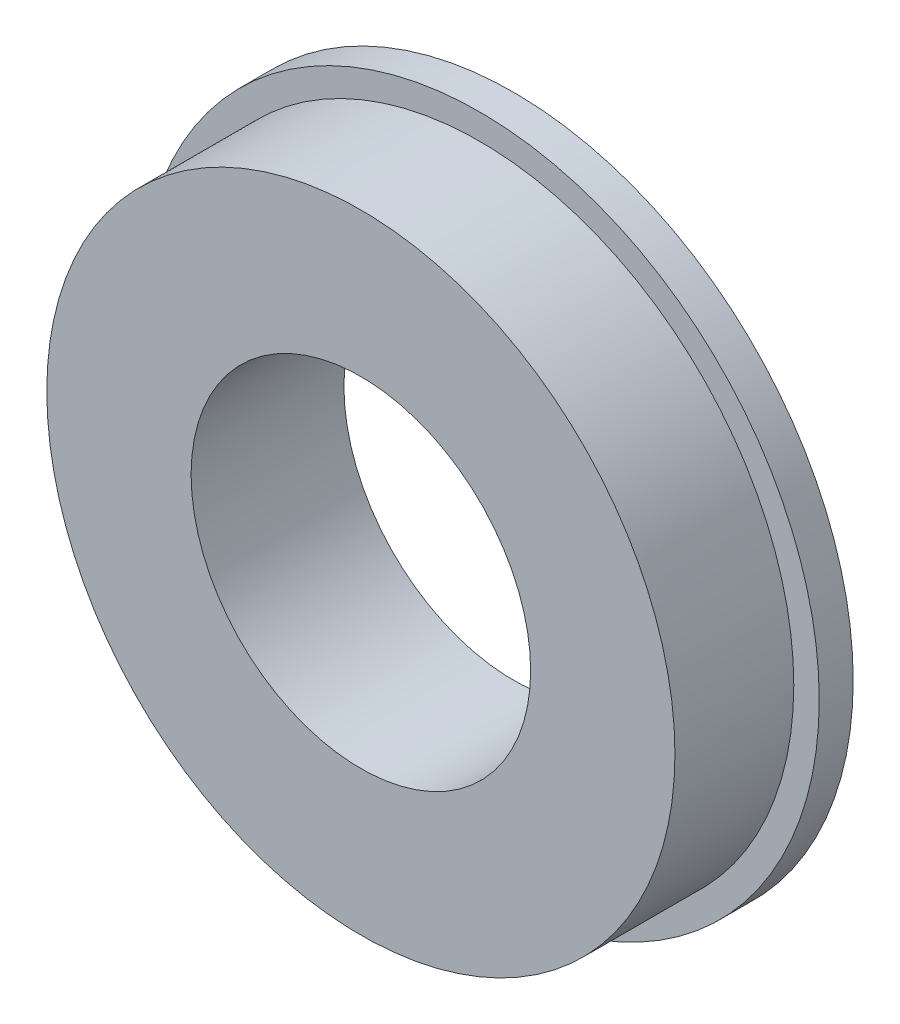
ISO-10303-21;
HEADER;
FILE_DESCRIPTION(('STEP AP214'),'2;1');
FILE_NAME('part.step','',(''),(''),'','','');
FILE_SCHEMA(('AUTOMOTIVE_DESIGN { 1 0 10303 214 1 1 1 1 }'));
ENDSEC;
DATA;
#1=APPLICATION_CONTEXT('core data for automotive mechanical design processes');
#2=APPLICATION_PROTOCOL_DEFINITION('international standard','automotive_design',2000,#1);
#3=PRODUCT_CONTEXT('',#1,'mechanical');
#4=PRODUCT('Part','Part','',(#3));
#5=PRODUCT_RELATED_PRODUCT_CATEGORY('part','',(#4));
#6=PRODUCT_DEFINITION_FORMATION('','',#4);
#7=PRODUCT_DEFINITION_CONTEXT('part definition',#1,'design');
#8=PRODUCT_DEFINITION('design','',#6,#7);
#9=PRODUCT_DEFINITION_SHAPE('','',#8);
#10=(LENGTH_UNIT() NAMED_UNIT(*) SI_UNIT(.MILLI.,.METRE.));
#11=(NAMED_UNIT(*) PLANE_ANGLE_UNIT() SI_UNIT($,.RADIAN.));
#12=(NAMED_UNIT(*) SI_UNIT($,.STERADIAN.) SOLID_ANGLE_UNIT());
#13=UNCERTAINTY_MEASURE_WITH_UNIT(LENGTH_MEASURE(1.E-05),#10,'distance_accuracy_value','');
#14=(GEOMETRIC_REPRESENTATION_CONTEXT(3) GLOBAL_UNCERTAINTY_ASSIGNED_CONTEXT((#13)) GLOBAL_UNIT_ASSIGNED_CONTEXT((#10,
#11,#12)) REPRESENTATION_CONTEXT('',''));
#15=CARTESIAN_POINT('',(0.,0.,0.));
#16=DIRECTION('',(0.,0.,1.));
#17=DIRECTION('',(1.,0.,0.));
#18=AXIS2_PLACEMENT_3D('',#15,#16,#17);
#19=CARTESIAN_POINT('',(0.,0.,0.));
#20=DIRECTION('',(0.,0.,1.));
#21=DIRECTION('',(1.,0.,0.));
#22=AXIS2_PLACEMENT_3D('',#19,#20,#21);
#23=PLANE('',#22);
#24=CARTESIAN_POINT('',(0.,0.,0.));
#25=DIRECTION('',(0.,0.,1.));
#26=DIRECTION('',(1.,0.,0.));
#27=AXIS2_PLACEMENT_3D('',#24,#25,#26);
#28=CIRCLE('',#27,10.);
#29=CARTESIAN_POINT('',(10.,0.,0.));
#30=VERTEX_POINT('',#29);
#31=EDGE_CURVE('E48',#30,#30,#28,.T.);
#32=ORIENTED_EDGE('',*,*,#31,.T.);
#33=EDGE_LOOP('',(#32));
#34=FACE_BOUND('',#33,.T.);
#35=CARTESIAN_POINT('',(0.,0.,0.));
#36=DIRECTION('',(0.,0.,-1.));
#37=DIRECTION('',(-1.,0.,0.));
#38=AXIS2_PLACEMENT_3D('',#35,#36,#37);
#39=CIRCLE('',#38,14.1663841240872);
#40=CARTESIAN_POINT('',(-14.1663841240872,0.,0.));
#41=VERTEX_POINT('',#40);
#42=EDGE_CURVE('E61',#41,#41,#39,.T.);
#43=ORIENTED_EDGE('',*,*,#42,.T.);
#44=EDGE_LOOP('',(#43));
#45=FACE_BOUND('',#44,.T.);
#46=ADVANCED_FACE('F31',(#34,#45),#23,.F.);
#47=CARTESIAN_POINT('',(0.,0.,2.));
#48=DIRECTION('',(0.,0.,-1.));
#49=DIRECTION('',(-1.,0.,0.));
#50=AXIS2_PLACEMENT_3D('',#47,#48,#49);
#51=CYLINDRICAL_SURFACE('',#50,20.);
#52=CARTESIAN_POINT('',(0.,0.,2.));
#53=DIRECTION('',(0.,0.,1.));
#54=DIRECTION('',(1.,0.,0.));
#55=AXIS2_PLACEMENT_3D('',#52,#53,#54);
#56=CIRCLE('',#55,20.);
#57=CARTESIAN_POINT('',(20.,0.,2.));
#58=VERTEX_POINT('',#57);
#59=EDGE_CURVE('E39',#58,#58,#56,.T.);
#60=ORIENTED_EDGE('',*,*,#59,.F.);
#61=EDGE_LOOP('',(#60));
#62=FACE_BOUND('',#61,.T.);
#63=CARTESIAN_POINT('',(0.,0.,0.));
#64=DIRECTION('',(0.,0.,1.));
#65=DIRECTION('',(1.,0.,0.));
#66=AXIS2_PLACEMENT_3D('',#63,#64,#65);
#67=CIRCLE('',#66,20.);
#68=CARTESIAN_POINT('',(20.,0.,0.));
#69=VERTEX_POINT('',#68);
#70=EDGE_CURVE('E35',#69,#69,#67,.T.);
#71=ORIENTED_EDGE('',*,*,#70,.T.);
#72=EDGE_LOOP('',(#71));
#73=FACE_BOUND('',#72,.T.);
#74=ADVANCED_FACE('F33',(#62,#73),#51,.T.);
#75=CARTESIAN_POINT('',(0.,0.,2.));
#76=DIRECTION('',(0.,0.,1.));
#77=DIRECTION('',(1.,0.,0.));
#78=AXIS2_PLACEMENT_3D('',#75,#76,#77);
#79=PLANE('',#78);
#80=CARTESIAN_POINT('',(0.,0.,2.));
#81=DIRECTION('',(0.,0.,1.));
#82=DIRECTION('',(1.,0.,0.));
#83=AXIS2_PLACEMENT_3D('',#80,#81,#82);
#84=CIRCLE('',#83,18.5);
#85=CARTESIAN_POINT('',(18.5,0.,2.));
#86=VERTEX_POINT('',#85);
#87=EDGE_CURVE('E10',#86,#86,#84,.T.);
#88=ORIENTED_EDGE('',*,*,#87,.F.);
#89=EDGE_LOOP('',(#88));
#90=FACE_BOUND('',#89,.T.);
#91=ORIENTED_EDGE('',*,*,#59,.T.);
#92=EDGE_LOOP('',(#91));
#93=FACE_BOUND('',#92,.T.);
#94=ADVANCED_FACE('F87',(#90,#93),#79,.T.);
#95=CARTESIAN_POINT('',(0.,0.,0.));
#96=DIRECTION('',(0.,0.,-1.));
#97=DIRECTION('',(-1.,0.,0.));
#98=AXIS2_PLACEMENT_3D('',#95,#96,#97);
#99=CIRCLE('',#98,16.6386159110818);
#100=CARTESIAN_POINT('',(-16.6386159110818,0.,0.));
#101=VERTEX_POINT('',#100);
#102=EDGE_CURVE('E55',#101,#101,#99,.T.);
#103=ORIENTED_EDGE('',*,*,#102,.F.);
#104=EDGE_LOOP('',(#103));
#105=FACE_BOUND('',#104,.T.);
#106=ORIENTED_EDGE('',*,*,#70,.F.);
#107=EDGE_LOOP('',(#106));
#108=FACE_BOUND('',#107,.T.);
#109=ADVANCED_FACE('F83',(#105,#108),#23,.F.);
#110=CARTESIAN_POINT('',(0.,0.,9.));
#111=DIRECTION('',(0.,0.,-1.));
#112=DIRECTION('',(-1.,0.,0.));
#113=AXIS2_PLACEMENT_3D('',#110,#111,#112);
#114=CYLINDRICAL_SURFACE('',#113,18.5);
#115=CARTESIAN_POINT('',(0.,0.,9.));
#116=DIRECTION('',(0.,0.,1.));
#117=DIRECTION('',(1.,0.,0.));
#118=AXIS2_PLACEMENT_3D('',#115,#116,#117);
#119=CIRCLE('',#118,18.5);
#120=CARTESIAN_POINT('',(18.5,0.,9.));
#121=VERTEX_POINT('',#120);
#122=EDGE_CURVE('E45',#121,#121,#119,.T.);
#123=ORIENTED_EDGE('',*,*,#122,.F.);
#124=EDGE_LOOP('',(#123));
#125=FACE_BOUND('',#124,.T.);
#126=ORIENTED_EDGE('',*,*,#87,.T.);
#127=EDGE_LOOP('',(#126));
#128=FACE_BOUND('',#127,.T.);
#129=ADVANCED_FACE('F86',(#125,#128),#114,.T.);
#130=CARTESIAN_POINT('',(0.,0.,9.));
#131=DIRECTION('',(0.,0.,1.));
#132=DIRECTION('',(1.,0.,0.));
#133=AXIS2_PLACEMENT_3D('',#130,#131,#132);
#134=PLANE('',#133);
#135=CARTESIAN_POINT('',(0.,0.,9.));
#136=DIRECTION('',(0.,0.,1.));
#137=DIRECTION('',(1.,0.,0.));
#138=AXIS2_PLACEMENT_3D('',#135,#136,#137);
#139=CIRCLE('',#138,10.);
#140=CARTESIAN_POINT('',(10.,0.,9.));
#141=VERTEX_POINT('',#140);
#142=EDGE_CURVE('E49',#141,#141,#139,.T.);
#143=ORIENTED_EDGE('',*,*,#142,.F.);
#144=EDGE_LOOP('',(#143));
#145=FACE_BOUND('',#144,.T.);
#146=ORIENTED_EDGE('',*,*,#122,.T.);
#147=EDGE_LOOP('',(#146));
#148=FACE_BOUND('',#147,.T.);
#149=ADVANCED_FACE('F108',(#145,#148),#134,.T.);
#150=CARTESIAN_POINT('',(0.,0.,0.));
#151=DIRECTION('',(0.,0.,1.));
#152=DIRECTION('',(1.,0.,0.));
#153=AXIS2_PLACEMENT_3D('',#150,#151,#152);
#154=CYLINDRICAL_SURFACE('',#153,10.);
#155=ORIENTED_EDGE('',*,*,#31,.F.);
#156=EDGE_LOOP('',(#155));
#157=FACE_BOUND('',#156,.T.);
#158=ORIENTED_EDGE('',*,*,#142,.T.);
#159=EDGE_LOOP('',(#158));
#160=FACE_BOUND('',#159,.T.);
#161=ADVANCED_FACE('F79',(#157,#160),#154,.F.);
#162=CARTESIAN_POINT('',(0.,0.,0.5));
#163=DIRECTION('',(0.,0.,-1.));
#164=DIRECTION('',(-1.,0.,0.));
#165=AXIS2_PLACEMENT_3D('',#162,#163,#164);
#166=CYLINDRICAL_SURFACE('',#165,16.6386159110818);
#167=CARTESIAN_POINT('',(0.,0.,0.5));
#168=DIRECTION('',(0.,0.,-1.));
#169=DIRECTION('',(-1.,0.,0.));
#170=AXIS2_PLACEMENT_3D('',#167,#168,#169);
#171=CIRCLE('',#170,16.6386159110818);
#172=CARTESIAN_POINT('',(-16.6386159110818,0.,0.5));
#173=VERTEX_POINT('',#172);
#174=EDGE_CURVE('E52',#173,#173,#171,.T.);
#175=ORIENTED_EDGE('',*,*,#174,.F.);
#176=EDGE_LOOP('',(#175));
#177=FACE_BOUND('',#176,.T.);
#178=ORIENTED_EDGE('',*,*,#102,.T.);
#179=EDGE_LOOP('',(#178));
#180=FACE_BOUND('',#179,.T.);
#181=ADVANCED_FACE('F73',(#177,#180),#166,.F.);
#182=CARTESIAN_POINT('',(0.,0.,0.5));
#183=DIRECTION('',(0.,0.,-1.));
#184=DIRECTION('',(-1.,0.,0.));
#185=AXIS2_PLACEMENT_3D('',#182,#183,#184);
#186=PLANE('',#185);
#187=CARTESIAN_POINT('',(0.,0.,0.5));
#188=DIRECTION('',(0.,0.,-1.));
#189=DIRECTION('',(-1.,0.,0.));
#190=AXIS2_PLACEMENT_3D('',#187,#188,#189);
#191=CIRCLE('',#190,14.1663841240872);
#192=CARTESIAN_POINT('',(-14.1663841240872,0.,0.5));
#193=VERTEX_POINT('',#192);
#194=EDGE_CURVE('E58',#193,#193,#191,.T.);
#195=ORIENTED_EDGE('',*,*,#194,.F.);
#196=EDGE_LOOP('',(#195));
#197=FACE_BOUND('',#196,.T.);
#198=ORIENTED_EDGE('',*,*,#174,.T.);
#199=EDGE_LOOP('',(#198));
#200=FACE_BOUND('',#199,.T.);
#201=ADVANCED_FACE('F70',(#197,#200),#186,.T.);
#202=CARTESIAN_POINT('',(0.,0.,0.5));
#203=DIRECTION('',(0.,0.,-1.));
#204=DIRECTION('',(-1.,0.,0.));
#205=AXIS2_PLACEMENT_3D('',#202,#203,#204);
#206=CYLINDRICAL_SURFACE('',#205,14.1663841240872);
#207=ORIENTED_EDGE('',*,*,#194,.T.);
#208=EDGE_LOOP('',(#207));
#209=FACE_BOUND('',#208,.T.);
#210=ORIENTED_EDGE('',*,*,#42,.F.);
#211=EDGE_LOOP('',(#210));
#212=FACE_BOUND('',#211,.T.);
#213=ADVANCED_FACE('F67',(#209,#212),#206,.T.);
#214=CLOSED_SHELL('',(#46,#74,#94,#109,#129,#149,#161,#181,#201,#213));
#215=MANIFOLD_SOLID_BREP('B2',#214);
#216=ADVANCED_BREP_SHAPE_REPRESENTATION('',(#18,#215),#14);
#217=SHAPE_DEFINITION_REPRESENTATION(#9,#216);
ENDSEC;
END-ISO-10303-21;
